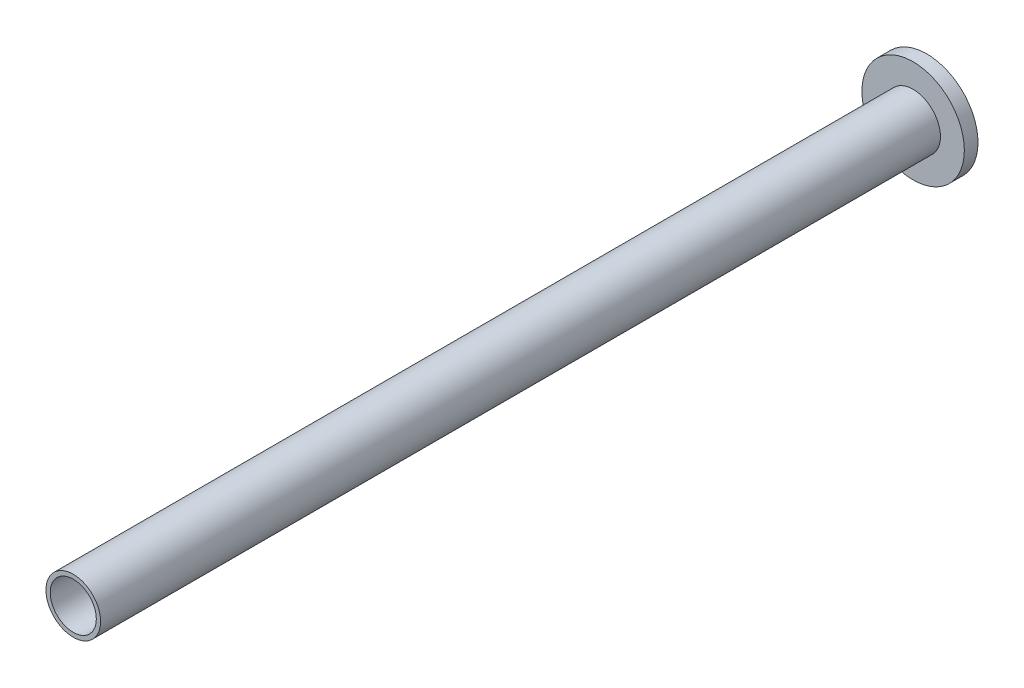
ISO-10303-21;
HEADER;
FILE_DESCRIPTION(('STEP AP214'),'2;1');
FILE_NAME('part.step','',(''),(''),'','','');
FILE_SCHEMA(('AUTOMOTIVE_DESIGN { 1 0 10303 214 1 1 1 1 }'));
ENDSEC;
DATA;
#1=APPLICATION_CONTEXT('core data for automotive mechanical design processes');
#2=APPLICATION_PROTOCOL_DEFINITION('international standard','automotive_design',2000,#1);
#3=PRODUCT_CONTEXT('',#1,'mechanical');
#4=PRODUCT('Part','Part','',(#3));
#5=PRODUCT_RELATED_PRODUCT_CATEGORY('part','',(#4));
#6=PRODUCT_DEFINITION_FORMATION('','',#4);
#7=PRODUCT_DEFINITION_CONTEXT('part definition',#1,'design');
#8=PRODUCT_DEFINITION('design','',#6,#7);
#9=PRODUCT_DEFINITION_SHAPE('','',#8);
#10=(LENGTH_UNIT() NAMED_UNIT(*) SI_UNIT(.MILLI.,.METRE.));
#11=(NAMED_UNIT(*) PLANE_ANGLE_UNIT() SI_UNIT($,.RADIAN.));
#12=(NAMED_UNIT(*) SI_UNIT($,.STERADIAN.) SOLID_ANGLE_UNIT());
#13=UNCERTAINTY_MEASURE_WITH_UNIT(LENGTH_MEASURE(1.E-05),#10,'distance_accuracy_value','');
#14=(GEOMETRIC_REPRESENTATION_CONTEXT(3) GLOBAL_UNCERTAINTY_ASSIGNED_CONTEXT((#13)) GLOBAL_UNIT_ASSIGNED_CONTEXT((#10,
#11,#12)) REPRESENTATION_CONTEXT('',''));
#15=CARTESIAN_POINT('',(0.,0.,0.));
#16=DIRECTION('',(0.,0.,1.));
#17=DIRECTION('',(1.,0.,0.));
#18=AXIS2_PLACEMENT_3D('',#15,#16,#17);
#19=CARTESIAN_POINT('',(860.,225.,308.));
#20=DIRECTION('',(0.,0.,-1.));
#21=DIRECTION('',(-1.,0.,0.));
#22=AXIS2_PLACEMENT_3D('',#19,#20,#21);
#23=CYLINDRICAL_SURFACE('',#22,30.);
#24=CARTESIAN_POINT('',(860.,225.,308.));
#25=DIRECTION('',(0.,0.,1.));
#26=DIRECTION('',(1.,0.,0.));
#27=AXIS2_PLACEMENT_3D('',#24,#25,#26);
#28=CIRCLE('',#27,30.);
#29=CARTESIAN_POINT('',(890.,225.,308.));
#30=VERTEX_POINT('',#29);
#31=EDGE_CURVE('E46',#30,#30,#28,.T.);
#32=ORIENTED_EDGE('',*,*,#31,.F.);
#33=EDGE_LOOP('',(#32));
#34=FACE_BOUND('',#33,.T.);
#35=CARTESIAN_POINT('',(860.,225.,300.));
#36=DIRECTION('',(0.,0.,1.));
#37=DIRECTION('',(1.,0.,0.));
#38=AXIS2_PLACEMENT_3D('',#35,#36,#37);
#39=CIRCLE('',#38,30.);
#40=CARTESIAN_POINT('',(890.,225.,300.));
#41=VERTEX_POINT('',#40);
#42=EDGE_CURVE('E45',#41,#41,#39,.T.);
#43=ORIENTED_EDGE('',*,*,#42,.T.);
#44=EDGE_LOOP('',(#43));
#45=FACE_BOUND('',#44,.T.);
#46=ADVANCED_FACE('F39',(#34,#45),#23,.T.);
#47=CARTESIAN_POINT('',(860.,225.,308.));
#48=DIRECTION('',(0.,0.,1.));
#49=DIRECTION('',(1.,0.,0.));
#50=AXIS2_PLACEMENT_3D('',#47,#48,#49);
#51=PLANE('',#50);
#52=CARTESIAN_POINT('',(860.,225.,308.));
#53=DIRECTION('',(0.,0.,1.));
#54=DIRECTION('',(1.,0.,0.));
#55=AXIS2_PLACEMENT_3D('',#52,#53,#54);
#56=CIRCLE('',#55,16.);
#57=CARTESIAN_POINT('',(876.,225.,308.));
#58=VERTEX_POINT('',#57);
#59=EDGE_CURVE('E10',#58,#58,#56,.T.);
#60=ORIENTED_EDGE('',*,*,#59,.F.);
#61=EDGE_LOOP('',(#60));
#62=FACE_BOUND('',#61,.T.);
#63=ORIENTED_EDGE('',*,*,#31,.T.);
#64=EDGE_LOOP('',(#63));
#65=FACE_BOUND('',#64,.T.);
#66=ADVANCED_FACE('F80',(#62,#65),#51,.T.);
#67=CARTESIAN_POINT('',(860.,225.,300.));
#68=DIRECTION('',(0.,0.,1.));
#69=DIRECTION('',(1.,0.,0.));
#70=AXIS2_PLACEMENT_3D('',#67,#68,#69);
#71=PLANE('',#70);
#72=ORIENTED_EDGE('',*,*,#42,.F.);
#73=EDGE_LOOP('',(#72));
#74=FACE_BOUND('',#73,.T.);
#75=ADVANCED_FACE('F69',(#74),#71,.F.);
#76=CARTESIAN_POINT('',(860.,225.,800.));
#77=DIRECTION('',(0.,0.,1.));
#78=DIRECTION('',(1.,0.,0.));
#79=AXIS2_PLACEMENT_3D('',#76,#77,#78);
#80=PLANE('',#79);
#81=CARTESIAN_POINT('',(860.,225.,800.));
#82=DIRECTION('',(0.,0.,1.));
#83=DIRECTION('',(1.,0.,0.));
#84=AXIS2_PLACEMENT_3D('',#81,#82,#83);
#85=CIRCLE('',#84,16.);
#86=CARTESIAN_POINT('',(876.,225.,800.));
#87=VERTEX_POINT('',#86);
#88=EDGE_CURVE('E55',#87,#87,#85,.T.);
#89=ORIENTED_EDGE('',*,*,#88,.T.);
#90=EDGE_LOOP('',(#89));
#91=FACE_BOUND('',#90,.T.);
#92=CARTESIAN_POINT('',(860.,225.,800.));
#93=DIRECTION('',(0.,0.,1.));
#94=DIRECTION('',(1.,0.,0.));
#95=AXIS2_PLACEMENT_3D('',#92,#93,#94);
#96=CIRCLE('',#95,13.5);
#97=CARTESIAN_POINT('',(873.5,225.,800.));
#98=VERTEX_POINT('',#97);
#99=EDGE_CURVE('E54',#98,#98,#96,.T.);
#100=ORIENTED_EDGE('',*,*,#99,.F.);
#101=EDGE_LOOP('',(#100));
#102=FACE_BOUND('',#101,.T.);
#103=ADVANCED_FACE('F63',(#91,#102),#80,.T.);
#104=CARTESIAN_POINT('',(860.,225.,800.));
#105=DIRECTION('',(0.,0.,-1.));
#106=DIRECTION('',(-1.,0.,0.));
#107=AXIS2_PLACEMENT_3D('',#104,#105,#106);
#108=CYLINDRICAL_SURFACE('',#107,16.);
#109=ORIENTED_EDGE('',*,*,#88,.F.);
#110=EDGE_LOOP('',(#109));
#111=FACE_BOUND('',#110,.T.);
#112=ORIENTED_EDGE('',*,*,#59,.T.);
#113=EDGE_LOOP('',(#112));
#114=FACE_BOUND('',#113,.T.);
#115=ADVANCED_FACE('F67',(#111,#114),#108,.T.);
#116=CARTESIAN_POINT('',(860.,225.,800.));
#117=DIRECTION('',(0.,0.,-1.));
#118=DIRECTION('',(-1.,0.,0.));
#119=AXIS2_PLACEMENT_3D('',#116,#117,#118);
#120=CYLINDRICAL_SURFACE('',#119,13.5);
#121=ORIENTED_EDGE('',*,*,#99,.T.);
#122=EDGE_LOOP('',(#121));
#123=FACE_BOUND('',#122,.T.);
#124=CARTESIAN_POINT('',(860.,225.,308.));
#125=DIRECTION('',(0.,0.,1.));
#126=DIRECTION('',(1.,0.,0.));
#127=AXIS2_PLACEMENT_3D('',#124,#125,#126);
#128=CIRCLE('',#127,13.5);
#129=CARTESIAN_POINT('',(873.5,225.,308.));
#130=VERTEX_POINT('',#129);
#131=EDGE_CURVE('E57',#130,#130,#128,.T.);
#132=ORIENTED_EDGE('',*,*,#131,.F.);
#133=EDGE_LOOP('',(#132));
#134=FACE_BOUND('',#133,.T.);
#135=ADVANCED_FACE('F65',(#123,#134),#120,.F.);
#136=ORIENTED_EDGE('',*,*,#131,.T.);
#137=EDGE_LOOP('',(#136));
#138=FACE_BOUND('',#137,.T.);
#139=ADVANCED_FACE('F86',(#138),#51,.T.);
#140=CLOSED_SHELL('',(#46,#66,#75,#103,#115,#135,#139));
#141=MANIFOLD_SOLID_BREP('B2',#140);
#142=ADVANCED_BREP_SHAPE_REPRESENTATION('',(#18,#141),#14);
#143=SHAPE_DEFINITION_REPRESENTATION(#9,#142);
ENDSEC;
END-ISO-10303-21;
